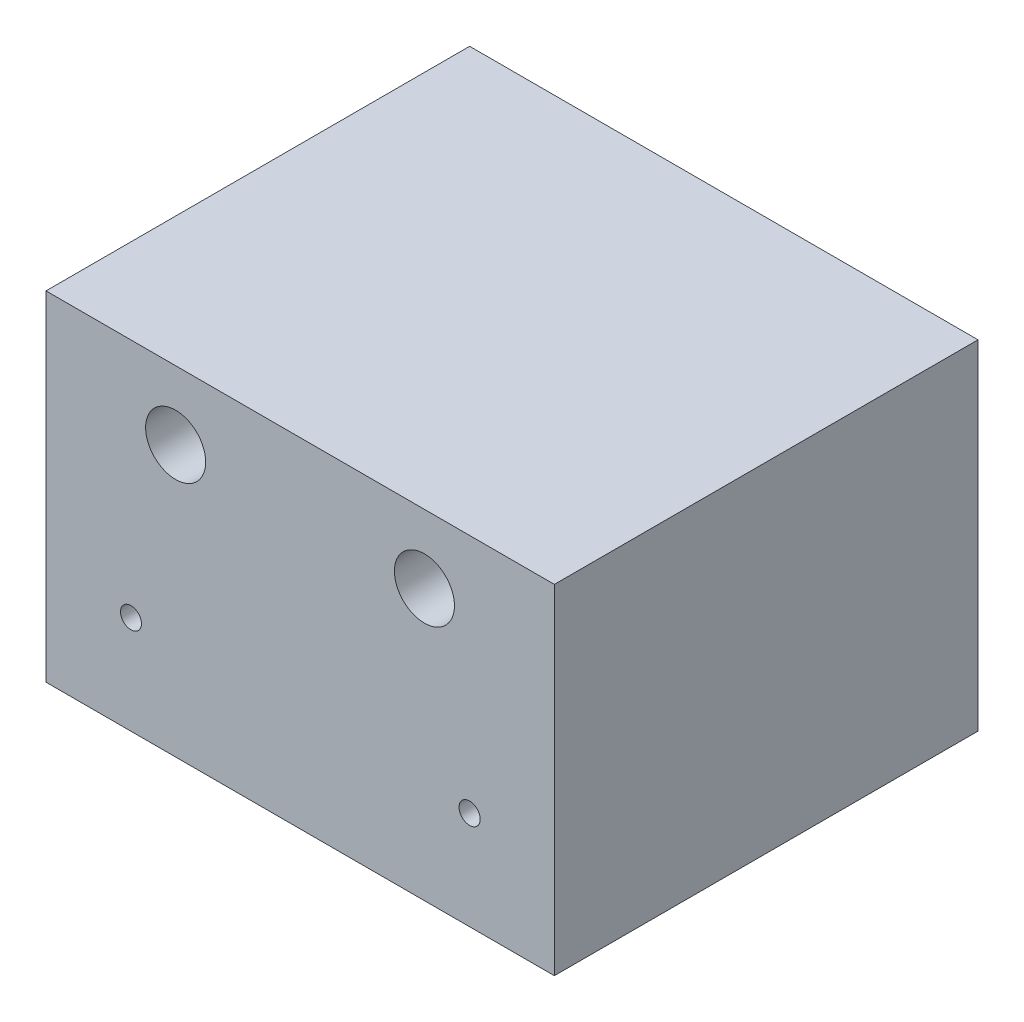
ISO-10303-21;
HEADER;
FILE_DESCRIPTION(('STEP AP214'),'2;1');
FILE_NAME('part.step','',(''),(''),'','','');
FILE_SCHEMA(('AUTOMOTIVE_DESIGN { 1 0 10303 214 1 1 1 1 }'));
ENDSEC;
DATA;
#1=APPLICATION_CONTEXT('core data for automotive mechanical design processes');
#2=APPLICATION_PROTOCOL_DEFINITION('international standard','automotive_design',2000,#1);
#3=PRODUCT_CONTEXT('',#1,'mechanical');
#4=PRODUCT('Part','Part','',(#3));
#5=PRODUCT_RELATED_PRODUCT_CATEGORY('part','',(#4));
#6=PRODUCT_DEFINITION_FORMATION('','',#4);
#7=PRODUCT_DEFINITION_CONTEXT('part definition',#1,'design');
#8=PRODUCT_DEFINITION('design','',#6,#7);
#9=PRODUCT_DEFINITION_SHAPE('','',#8);
#10=(LENGTH_UNIT() NAMED_UNIT(*) SI_UNIT(.MILLI.,.METRE.));
#11=(NAMED_UNIT(*) PLANE_ANGLE_UNIT() SI_UNIT($,.RADIAN.));
#12=(NAMED_UNIT(*) SI_UNIT($,.STERADIAN.) SOLID_ANGLE_UNIT());
#13=UNCERTAINTY_MEASURE_WITH_UNIT(LENGTH_MEASURE(1.E-05),#10,'distance_accuracy_value','');
#14=(GEOMETRIC_REPRESENTATION_CONTEXT(3) GLOBAL_UNCERTAINTY_ASSIGNED_CONTEXT((#13)) GLOBAL_UNIT_ASSIGNED_CONTEXT((#10,
#11,#12)) REPRESENTATION_CONTEXT('',''));
#15=CARTESIAN_POINT('',(0.,0.,0.));
#16=DIRECTION('',(0.,0.,1.));
#17=DIRECTION('',(1.,0.,0.));
#18=AXIS2_PLACEMENT_3D('',#15,#16,#17);
#19=CARTESIAN_POINT('',(0.,0.,127.));
#20=DIRECTION('',(0.,1.,0.));
#21=DIRECTION('',(0.,0.,1.));
#22=AXIS2_PLACEMENT_3D('',#19,#20,#21);
#23=PLANE('',#22);
#24=DIRECTION('',(1.,0.,0.));
#25=VECTOR('',#24,1.);
#26=CARTESIAN_POINT('',(0.,0.,0.));
#27=LINE('',#26,#25);
#28=CARTESIAN_POINT('',(-152.4,0.,0.));
#29=VERTEX_POINT('',#28);
#30=CARTESIAN_POINT('',(0.,0.,0.));
#31=VERTEX_POINT('',#30);
#32=EDGE_CURVE('E114',#29,#31,#27,.T.);
#33=ORIENTED_EDGE('',*,*,#32,.T.);
#34=DIRECTION('',(0.,0.,-1.));
#35=VECTOR('',#34,1.);
#36=CARTESIAN_POINT('',(0.,0.,127.));
#37=LINE('',#36,#35);
#38=CARTESIAN_POINT('',(0.,0.,127.));
#39=VERTEX_POINT('',#38);
#40=EDGE_CURVE('E11',#39,#31,#37,.T.);
#41=ORIENTED_EDGE('',*,*,#40,.F.);
#42=DIRECTION('',(1.,0.,0.));
#43=VECTOR('',#42,1.);
#44=CARTESIAN_POINT('',(0.,0.,127.));
#45=LINE('',#44,#43);
#46=CARTESIAN_POINT('',(-152.4,0.,127.));
#47=VERTEX_POINT('',#46);
#48=EDGE_CURVE('E78',#47,#39,#45,.T.);
#49=ORIENTED_EDGE('',*,*,#48,.F.);
#50=DIRECTION('',(0.,0.,-1.));
#51=VECTOR('',#50,1.);
#52=CARTESIAN_POINT('',(-152.4,0.,127.));
#53=LINE('',#52,#51);
#54=EDGE_CURVE('E113',#47,#29,#53,.T.);
#55=ORIENTED_EDGE('',*,*,#54,.T.);
#56=EDGE_LOOP('',(#33,#41,#49,#55));
#57=FACE_BOUND('',#56,.T.);
#58=ADVANCED_FACE('F39',(#57),#23,.F.);
#59=CARTESIAN_POINT('',(0.,0.,127.));
#60=DIRECTION('',(1.,0.,0.));
#61=DIRECTION('',(0.,0.,-1.));
#62=AXIS2_PLACEMENT_3D('',#59,#60,#61);
#63=PLANE('',#62);
#64=DIRECTION('',(0.,-1.,0.));
#65=VECTOR('',#64,1.);
#66=CARTESIAN_POINT('',(0.,0.,0.));
#67=LINE('',#66,#65);
#68=CARTESIAN_POINT('',(0.,101.6,0.));
#69=VERTEX_POINT('',#68);
#70=EDGE_CURVE('E87',#69,#31,#67,.T.);
#71=ORIENTED_EDGE('',*,*,#70,.F.);
#72=DIRECTION('',(0.,0.,-1.));
#73=VECTOR('',#72,1.);
#74=CARTESIAN_POINT('',(0.,101.6,127.));
#75=LINE('',#74,#73);
#76=CARTESIAN_POINT('',(0.,101.6,127.));
#77=VERTEX_POINT('',#76);
#78=EDGE_CURVE('E47',#77,#69,#75,.T.);
#79=ORIENTED_EDGE('',*,*,#78,.F.);
#80=DIRECTION('',(0.,-1.,0.));
#81=VECTOR('',#80,1.);
#82=CARTESIAN_POINT('',(0.,0.,127.));
#83=LINE('',#82,#81);
#84=EDGE_CURVE('E85',#77,#39,#83,.T.);
#85=ORIENTED_EDGE('',*,*,#84,.T.);
#86=ORIENTED_EDGE('',*,*,#40,.T.);
#87=EDGE_LOOP('',(#71,#79,#85,#86));
#88=FACE_BOUND('',#87,.T.);
#89=ADVANCED_FACE('F84',(#88),#63,.T.);
#90=CARTESIAN_POINT('',(0.,101.6,127.));
#91=DIRECTION('',(0.,1.,0.));
#92=DIRECTION('',(0.,0.,1.));
#93=AXIS2_PLACEMENT_3D('',#90,#91,#92);
#94=PLANE('',#93);
#95=DIRECTION('',(1.,0.,0.));
#96=VECTOR('',#95,1.);
#97=CARTESIAN_POINT('',(0.,101.6,0.));
#98=LINE('',#97,#96);
#99=CARTESIAN_POINT('',(-152.4,101.6,0.));
#100=VERTEX_POINT('',#99);
#101=EDGE_CURVE('E118',#100,#69,#98,.T.);
#102=ORIENTED_EDGE('',*,*,#101,.F.);
#103=DIRECTION('',(0.,0.,-1.));
#104=VECTOR('',#103,1.);
#105=CARTESIAN_POINT('',(-152.4,101.6,127.));
#106=LINE('',#105,#104);
#107=CARTESIAN_POINT('',(-152.4,101.6,127.));
#108=VERTEX_POINT('',#107);
#109=EDGE_CURVE('E70',#108,#100,#106,.T.);
#110=ORIENTED_EDGE('',*,*,#109,.F.);
#111=DIRECTION('',(1.,0.,0.));
#112=VECTOR('',#111,1.);
#113=CARTESIAN_POINT('',(0.,101.6,127.));
#114=LINE('',#113,#112);
#115=EDGE_CURVE('E94',#108,#77,#114,.T.);
#116=ORIENTED_EDGE('',*,*,#115,.T.);
#117=ORIENTED_EDGE('',*,*,#78,.T.);
#118=EDGE_LOOP('',(#102,#110,#116,#117));
#119=FACE_BOUND('',#118,.T.);
#120=ADVANCED_FACE('F96',(#119),#94,.T.);
#121=CARTESIAN_POINT('',(-126.923613038757,29.4837170511796,127.));
#122=DIRECTION('',(0.,0.,-1.));
#123=DIRECTION('',(-1.,0.,0.));
#124=AXIS2_PLACEMENT_3D('',#121,#122,#123);
#125=CYLINDRICAL_SURFACE('',#124,3.14221906512558);
#126=CARTESIAN_POINT('',(-126.923613038757,29.4837170511796,127.));
#127=DIRECTION('',(0.,0.,1.));
#128=DIRECTION('',(1.,0.,0.));
#129=AXIS2_PLACEMENT_3D('',#126,#127,#128);
#130=CIRCLE('',#129,3.14221906512558);
#131=CARTESIAN_POINT('',(-123.781393973632,29.4837170511796,127.));
#132=VERTEX_POINT('',#131);
#133=EDGE_CURVE('E107',#132,#132,#130,.T.);
#134=ORIENTED_EDGE('',*,*,#133,.T.);
#135=EDGE_LOOP('',(#134));
#136=FACE_BOUND('',#135,.T.);
#137=CARTESIAN_POINT('',(-126.923613038757,29.4837170511796,0.));
#138=DIRECTION('',(0.,0.,1.));
#139=DIRECTION('',(1.,0.,0.));
#140=AXIS2_PLACEMENT_3D('',#137,#138,#139);
#141=CIRCLE('',#140,3.14221906512558);
#142=CARTESIAN_POINT('',(-123.781393973632,29.4837170511796,0.));
#143=VERTEX_POINT('',#142);
#144=EDGE_CURVE('E127',#143,#143,#141,.T.);
#145=ORIENTED_EDGE('',*,*,#144,.F.);
#146=EDGE_LOOP('',(#145));
#147=FACE_BOUND('',#146,.T.);
#148=ADVANCED_FACE('F169',(#136,#147),#125,.F.);
#149=CARTESIAN_POINT('',(-113.538,81.0613510847149,127.));
#150=DIRECTION('',(0.,0.,-1.));
#151=DIRECTION('',(-1.,0.,0.));
#152=AXIS2_PLACEMENT_3D('',#149,#150,#151);
#153=CYLINDRICAL_SURFACE('',#152,8.9999947);
#154=CARTESIAN_POINT('',(-113.538,81.0613510847149,127.));
#155=DIRECTION('',(0.,0.,1.));
#156=DIRECTION('',(1.,0.,0.));
#157=AXIS2_PLACEMENT_3D('',#154,#155,#156);
#158=CIRCLE('',#157,8.9999947);
#159=CARTESIAN_POINT('',(-104.5380053,81.0613510847149,127.));
#160=VERTEX_POINT('',#159);
#161=EDGE_CURVE('E104',#160,#160,#158,.T.);
#162=ORIENTED_EDGE('',*,*,#161,.T.);
#163=EDGE_LOOP('',(#162));
#164=FACE_BOUND('',#163,.T.);
#165=CARTESIAN_POINT('',(-113.538,81.0613510847149,0.));
#166=DIRECTION('',(0.,0.,1.));
#167=DIRECTION('',(1.,0.,0.));
#168=AXIS2_PLACEMENT_3D('',#165,#166,#167);
#169=CIRCLE('',#168,8.9999947);
#170=CARTESIAN_POINT('',(-104.5380053,81.0613510847149,0.));
#171=VERTEX_POINT('',#170);
#172=EDGE_CURVE('E124',#171,#171,#169,.T.);
#173=ORIENTED_EDGE('',*,*,#172,.F.);
#174=EDGE_LOOP('',(#173));
#175=FACE_BOUND('',#174,.T.);
#176=ADVANCED_FACE('F174',(#164,#175),#153,.F.);
#177=CARTESIAN_POINT('',(-38.9521336608494,81.0613510847149,127.));
#178=DIRECTION('',(0.,0.,-1.));
#179=DIRECTION('',(-1.,0.,0.));
#180=AXIS2_PLACEMENT_3D('',#177,#178,#179);
#181=CYLINDRICAL_SURFACE('',#180,8.9999947);
#182=CARTESIAN_POINT('',(-38.9521336608494,81.0613510847149,127.));
#183=DIRECTION('',(0.,0.,1.));
#184=DIRECTION('',(1.,0.,0.));
#185=AXIS2_PLACEMENT_3D('',#182,#183,#184);
#186=CIRCLE('',#185,8.9999947);
#187=CARTESIAN_POINT('',(-29.9521389608495,81.0613510847149,127.));
#188=VERTEX_POINT('',#187);
#189=EDGE_CURVE('E98',#188,#188,#186,.T.);
#190=ORIENTED_EDGE('',*,*,#189,.T.);
#191=EDGE_LOOP('',(#190));
#192=FACE_BOUND('',#191,.T.);
#193=CARTESIAN_POINT('',(-38.9521336608494,81.0613510847149,0.));
#194=DIRECTION('',(0.,0.,1.));
#195=DIRECTION('',(1.,0.,0.));
#196=AXIS2_PLACEMENT_3D('',#193,#194,#195);
#197=CIRCLE('',#196,8.9999947);
#198=CARTESIAN_POINT('',(-29.9521389608495,81.0613510847149,0.));
#199=VERTEX_POINT('',#198);
#200=EDGE_CURVE('E121',#199,#199,#197,.T.);
#201=ORIENTED_EDGE('',*,*,#200,.F.);
#202=EDGE_LOOP('',(#201));
#203=FACE_BOUND('',#202,.T.);
#204=ADVANCED_FACE('F159',(#192,#203),#181,.F.);
#205=CARTESIAN_POINT('',(-152.4,0.,127.));
#206=DIRECTION('',(1.,0.,0.));
#207=DIRECTION('',(0.,0.,-1.));
#208=AXIS2_PLACEMENT_3D('',#205,#206,#207);
#209=PLANE('',#208);
#210=DIRECTION('',(0.,-1.,0.));
#211=VECTOR('',#210,1.);
#212=CARTESIAN_POINT('',(-152.4,0.,0.));
#213=LINE('',#212,#211);
#214=EDGE_CURVE('E73',#100,#29,#213,.T.);
#215=ORIENTED_EDGE('',*,*,#214,.T.);
#216=ORIENTED_EDGE('',*,*,#54,.F.);
#217=DIRECTION('',(0.,-1.,0.));
#218=VECTOR('',#217,1.);
#219=CARTESIAN_POINT('',(-152.4,0.,127.));
#220=LINE('',#219,#218);
#221=EDGE_CURVE('E55',#108,#47,#220,.T.);
#222=ORIENTED_EDGE('',*,*,#221,.F.);
#223=ORIENTED_EDGE('',*,*,#109,.T.);
#224=EDGE_LOOP('',(#215,#216,#222,#223));
#225=FACE_BOUND('',#224,.T.);
#226=ADVANCED_FACE('F151',(#225),#209,.F.);
#227=CARTESIAN_POINT('',(-25.4,29.4837170511796,127.));
#228=DIRECTION('',(0.,0.,-1.));
#229=DIRECTION('',(-1.,0.,0.));
#230=AXIS2_PLACEMENT_3D('',#227,#228,#229);
#231=CYLINDRICAL_SURFACE('',#230,3.175);
#232=CARTESIAN_POINT('',(-25.4,29.4837170511796,127.));
#233=DIRECTION('',(0.,0.,1.));
#234=DIRECTION('',(1.,0.,0.));
#235=AXIS2_PLACEMENT_3D('',#232,#233,#234);
#236=CIRCLE('',#235,3.175);
#237=CARTESIAN_POINT('',(-22.225,29.4837170511796,127.));
#238=VERTEX_POINT('',#237);
#239=EDGE_CURVE('E110',#238,#238,#236,.T.);
#240=ORIENTED_EDGE('',*,*,#239,.T.);
#241=EDGE_LOOP('',(#240));
#242=FACE_BOUND('',#241,.T.);
#243=CARTESIAN_POINT('',(-25.4,29.4837170511796,0.));
#244=DIRECTION('',(0.,0.,1.));
#245=DIRECTION('',(1.,0.,0.));
#246=AXIS2_PLACEMENT_3D('',#243,#244,#245);
#247=CIRCLE('',#246,3.175);
#248=CARTESIAN_POINT('',(-22.225,29.4837170511796,0.));
#249=VERTEX_POINT('',#248);
#250=EDGE_CURVE('E130',#249,#249,#247,.T.);
#251=ORIENTED_EDGE('',*,*,#250,.F.);
#252=EDGE_LOOP('',(#251));
#253=FACE_BOUND('',#252,.T.);
#254=ADVANCED_FACE('F149',(#242,#253),#231,.F.);
#255=CARTESIAN_POINT('',(0.,0.,127.));
#256=DIRECTION('',(0.,0.,1.));
#257=DIRECTION('',(1.,0.,0.));
#258=AXIS2_PLACEMENT_3D('',#255,#256,#257);
#259=PLANE('',#258);
#260=ORIENTED_EDGE('',*,*,#48,.T.);
#261=ORIENTED_EDGE('',*,*,#84,.F.);
#262=ORIENTED_EDGE('',*,*,#115,.F.);
#263=ORIENTED_EDGE('',*,*,#221,.T.);
#264=EDGE_LOOP('',(#260,#261,#262,#263));
#265=FACE_BOUND('',#264,.T.);
#266=ORIENTED_EDGE('',*,*,#189,.F.);
#267=EDGE_LOOP('',(#266));
#268=FACE_BOUND('',#267,.T.);
#269=ORIENTED_EDGE('',*,*,#161,.F.);
#270=EDGE_LOOP('',(#269));
#271=FACE_BOUND('',#270,.T.);
#272=ORIENTED_EDGE('',*,*,#133,.F.);
#273=EDGE_LOOP('',(#272));
#274=FACE_BOUND('',#273,.T.);
#275=ORIENTED_EDGE('',*,*,#239,.F.);
#276=EDGE_LOOP('',(#275));
#277=FACE_BOUND('',#276,.T.);
#278=ADVANCED_FACE('F92',(#265,#268,#271,#274,#277),#259,.T.);
#279=CARTESIAN_POINT('',(0.,0.,0.));
#280=DIRECTION('',(0.,0.,1.));
#281=DIRECTION('',(1.,0.,0.));
#282=AXIS2_PLACEMENT_3D('',#279,#280,#281);
#283=PLANE('',#282);
#284=ORIENTED_EDGE('',*,*,#32,.F.);
#285=ORIENTED_EDGE('',*,*,#214,.F.);
#286=ORIENTED_EDGE('',*,*,#101,.T.);
#287=ORIENTED_EDGE('',*,*,#70,.T.);
#288=EDGE_LOOP('',(#284,#285,#286,#287));
#289=FACE_BOUND('',#288,.T.);
#290=ORIENTED_EDGE('',*,*,#200,.T.);
#291=EDGE_LOOP('',(#290));
#292=FACE_BOUND('',#291,.T.);
#293=ORIENTED_EDGE('',*,*,#172,.T.);
#294=EDGE_LOOP('',(#293));
#295=FACE_BOUND('',#294,.T.);
#296=ORIENTED_EDGE('',*,*,#144,.T.);
#297=EDGE_LOOP('',(#296));
#298=FACE_BOUND('',#297,.T.);
#299=ORIENTED_EDGE('',*,*,#250,.T.);
#300=EDGE_LOOP('',(#299));
#301=FACE_BOUND('',#300,.T.);
#302=ADVANCED_FACE('F137',(#289,#292,#295,#298,#301),#283,.F.);
#303=CLOSED_SHELL('',(#58,#89,#120,#148,#176,#204,#226,#254,#278,#302));
#304=MANIFOLD_SOLID_BREP('B2',#303);
#305=ADVANCED_BREP_SHAPE_REPRESENTATION('',(#18,#304),#14);
#306=SHAPE_DEFINITION_REPRESENTATION(#9,#305);
ENDSEC;
END-ISO-10303-21;
